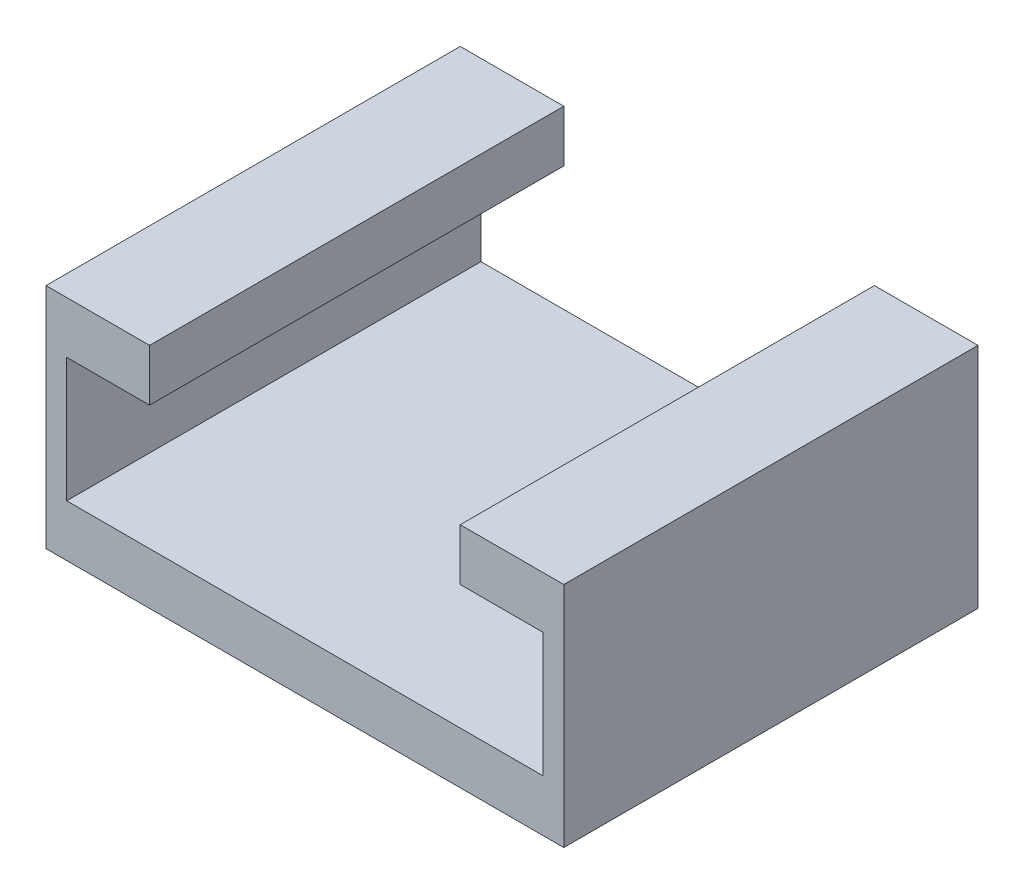
ISO-10303-21;
HEADER;
FILE_DESCRIPTION(('STEP AP214'),'2;1');
FILE_NAME('part.step','',(''),(''),'','','');
FILE_SCHEMA(('AUTOMOTIVE_DESIGN { 1 0 10303 214 1 1 1 1 }'));
ENDSEC;
DATA;
#1=APPLICATION_CONTEXT('core data for automotive mechanical design processes');
#2=APPLICATION_PROTOCOL_DEFINITION('international standard','automotive_design',2000,#1);
#3=PRODUCT_CONTEXT('',#1,'mechanical');
#4=PRODUCT('Part','Part','',(#3));
#5=PRODUCT_RELATED_PRODUCT_CATEGORY('part','',(#4));
#6=PRODUCT_DEFINITION_FORMATION('','',#4);
#7=PRODUCT_DEFINITION_CONTEXT('part definition',#1,'design');
#8=PRODUCT_DEFINITION('design','',#6,#7);
#9=PRODUCT_DEFINITION_SHAPE('','',#8);
#10=(LENGTH_UNIT() NAMED_UNIT(*) SI_UNIT(.MILLI.,.METRE.));
#11=(NAMED_UNIT(*) PLANE_ANGLE_UNIT() SI_UNIT($,.RADIAN.));
#12=(NAMED_UNIT(*) SI_UNIT($,.STERADIAN.) SOLID_ANGLE_UNIT());
#13=UNCERTAINTY_MEASURE_WITH_UNIT(LENGTH_MEASURE(1.E-05),#10,'distance_accuracy_value','');
#14=(GEOMETRIC_REPRESENTATION_CONTEXT(3) GLOBAL_UNCERTAINTY_ASSIGNED_CONTEXT((#13)) GLOBAL_UNIT_ASSIGNED_CONTEXT((#10,
#11,#12)) REPRESENTATION_CONTEXT('',''));
#15=CARTESIAN_POINT('',(0.,0.,0.));
#16=DIRECTION('',(0.,0.,1.));
#17=DIRECTION('',(1.,0.,0.));
#18=AXIS2_PLACEMENT_3D('',#15,#16,#17);
#19=CARTESIAN_POINT('',(0.,0.,0.));
#20=DIRECTION('',(0.,1.,0.));
#21=DIRECTION('',(0.,0.,1.));
#22=AXIS2_PLACEMENT_3D('',#19,#20,#21);
#23=PLANE('',#22);
#24=DIRECTION('',(1.,0.,0.));
#25=VECTOR('',#24,1.);
#26=CARTESIAN_POINT('',(0.,0.,0.));
#27=LINE('',#26,#25);
#28=CARTESIAN_POINT('',(0.,0.,0.));
#29=VERTEX_POINT('',#28);
#30=CARTESIAN_POINT('',(50.,0.,0.));
#31=VERTEX_POINT('',#30);
#32=EDGE_CURVE('E270',#29,#31,#27,.T.);
#33=ORIENTED_EDGE('',*,*,#32,.F.);
#34=DIRECTION('',(0.,0.,-1.));
#35=VECTOR('',#34,1.);
#36=CARTESIAN_POINT('',(0.,0.,0.));
#37=LINE('',#36,#35);
#38=CARTESIAN_POINT('',(0.,0.,-40.));
#39=VERTEX_POINT('',#38);
#40=EDGE_CURVE('E285',#29,#39,#37,.T.);
#41=ORIENTED_EDGE('',*,*,#40,.T.);
#42=DIRECTION('',(1.,0.,0.));
#43=VECTOR('',#42,1.);
#44=CARTESIAN_POINT('',(0.,0.,-40.));
#45=LINE('',#44,#43);
#46=CARTESIAN_POINT('',(50.,0.,-40.));
#47=VERTEX_POINT('',#46);
#48=EDGE_CURVE('E279',#39,#47,#45,.T.);
#49=ORIENTED_EDGE('',*,*,#48,.T.);
#50=DIRECTION('',(0.,0.,-1.));
#51=VECTOR('',#50,1.);
#52=CARTESIAN_POINT('',(50.,0.,0.));
#53=LINE('',#52,#51);
#54=EDGE_CURVE('E274',#31,#47,#53,.T.);
#55=ORIENTED_EDGE('',*,*,#54,.F.);
#56=EDGE_LOOP('',(#33,#41,#49,#55));
#57=FACE_BOUND('',#56,.T.);
#58=DIRECTION('',(0.,0.,-1.));
#59=VECTOR('',#58,1.);
#60=CARTESIAN_POINT('',(10.,0.,0.));
#61=LINE('',#60,#59);
#62=CARTESIAN_POINT('',(10.,0.,-23.5));
#63=VERTEX_POINT('',#62);
#64=CARTESIAN_POINT('',(10.,0.,-28.5));
#65=VERTEX_POINT('',#64);
#66=EDGE_CURVE('E162',#63,#65,#61,.T.);
#67=ORIENTED_EDGE('',*,*,#66,.F.);
#68=DIRECTION('',(1.,0.,0.));
#69=VECTOR('',#68,1.);
#70=CARTESIAN_POINT('',(10.,0.,-23.5));
#71=LINE('',#70,#69);
#72=CARTESIAN_POINT('',(40.,0.,-23.5));
#73=VERTEX_POINT('',#72);
#74=EDGE_CURVE('E189',#63,#73,#71,.T.);
#75=ORIENTED_EDGE('',*,*,#74,.T.);
#76=DIRECTION('',(0.,0.,-1.));
#77=VECTOR('',#76,1.);
#78=CARTESIAN_POINT('',(40.,0.,0.));
#79=LINE('',#78,#77);
#80=CARTESIAN_POINT('',(40.,0.,-28.5));
#81=VERTEX_POINT('',#80);
#82=EDGE_CURVE('E170',#73,#81,#79,.T.);
#83=ORIENTED_EDGE('',*,*,#82,.T.);
#84=DIRECTION('',(1.,0.,0.));
#85=VECTOR('',#84,1.);
#86=CARTESIAN_POINT('',(10.,0.,-28.5));
#87=LINE('',#86,#85);
#88=EDGE_CURVE('E192',#65,#81,#87,.T.);
#89=ORIENTED_EDGE('',*,*,#88,.F.);
#90=EDGE_LOOP('',(#67,#75,#83,#89));
#91=FACE_BOUND('',#90,.T.);
#92=ADVANCED_FACE('F35',(#57,#91),#23,.F.);
#93=CARTESIAN_POINT('',(0.,5.,0.));
#94=DIRECTION('',(0.,1.,0.));
#95=DIRECTION('',(0.,0.,1.));
#96=AXIS2_PLACEMENT_3D('',#93,#94,#95);
#97=PLANE('',#96);
#98=DIRECTION('',(1.,0.,0.));
#99=VECTOR('',#98,1.);
#100=CARTESIAN_POINT('',(0.,5.,0.));
#101=LINE('',#100,#99);
#102=CARTESIAN_POINT('',(2.,5.,0.));
#103=VERTEX_POINT('',#102);
#104=CARTESIAN_POINT('',(48.,5.,0.));
#105=VERTEX_POINT('',#104);
#106=EDGE_CURVE('E288',#103,#105,#101,.T.);
#107=ORIENTED_EDGE('',*,*,#106,.T.);
#108=DIRECTION('',(0.,0.,1.));
#109=VECTOR('',#108,1.);
#110=CARTESIAN_POINT('',(48.,5.,-40.));
#111=LINE('',#110,#109);
#112=CARTESIAN_POINT('',(48.,5.,-40.));
#113=VERTEX_POINT('',#112);
#114=EDGE_CURVE('E60',#113,#105,#111,.T.);
#115=ORIENTED_EDGE('',*,*,#114,.F.);
#116=DIRECTION('',(1.,0.,0.));
#117=VECTOR('',#116,1.);
#118=CARTESIAN_POINT('',(0.,5.,-40.));
#119=LINE('',#118,#117);
#120=CARTESIAN_POINT('',(2.,5.,-40.));
#121=VERTEX_POINT('',#120);
#122=EDGE_CURVE('E263',#121,#113,#119,.T.);
#123=ORIENTED_EDGE('',*,*,#122,.F.);
#124=DIRECTION('',(0.,0.,-1.));
#125=VECTOR('',#124,1.);
#126=CARTESIAN_POINT('',(2.,5.,-40.));
#127=LINE('',#126,#125);
#128=EDGE_CURVE('E250',#103,#121,#127,.T.);
#129=ORIENTED_EDGE('',*,*,#128,.F.);
#130=EDGE_LOOP('',(#107,#115,#123,#129));
#131=FACE_BOUND('',#130,.T.);
#132=ADVANCED_FACE('F338',(#131),#97,.T.);
#133=CARTESIAN_POINT('',(0.,5.,0.));
#134=DIRECTION('',(0.,0.,-1.));
#135=DIRECTION('',(-1.,0.,0.));
#136=AXIS2_PLACEMENT_3D('',#133,#134,#135);
#137=PLANE('',#136);
#138=ORIENTED_EDGE('',*,*,#32,.T.);
#139=DIRECTION('',(0.,-1.,0.));
#140=VECTOR('',#139,1.);
#141=CARTESIAN_POINT('',(50.,5.,0.));
#142=LINE('',#141,#140);
#143=CARTESIAN_POINT('',(50.,22.,0.));
#144=VERTEX_POINT('',#143);
#145=EDGE_CURVE('E11',#144,#31,#142,.T.);
#146=ORIENTED_EDGE('',*,*,#145,.F.);
#147=DIRECTION('',(1.,0.,0.));
#148=VECTOR('',#147,1.);
#149=CARTESIAN_POINT('',(50.,22.,0.));
#150=LINE('',#149,#148);
#151=CARTESIAN_POINT('',(40.,22.,0.));
#152=VERTEX_POINT('',#151);
#153=EDGE_CURVE('E203',#152,#144,#150,.T.);
#154=ORIENTED_EDGE('',*,*,#153,.F.);
#155=DIRECTION('',(0.,-1.,0.));
#156=VECTOR('',#155,1.);
#157=CARTESIAN_POINT('',(40.,22.,0.));
#158=LINE('',#157,#156);
#159=CARTESIAN_POINT('',(40.,17.,0.));
#160=VERTEX_POINT('',#159);
#161=EDGE_CURVE('E206',#152,#160,#158,.T.);
#162=ORIENTED_EDGE('',*,*,#161,.T.);
#163=DIRECTION('',(1.,0.,0.));
#164=VECTOR('',#163,1.);
#165=CARTESIAN_POINT('',(50.,17.,0.));
#166=LINE('',#165,#164);
#167=CARTESIAN_POINT('',(48.,17.,0.));
#168=VERTEX_POINT('',#167);
#169=EDGE_CURVE('E199',#160,#168,#166,.T.);
#170=ORIENTED_EDGE('',*,*,#169,.T.);
#171=DIRECTION('',(0.,-1.,0.));
#172=VECTOR('',#171,1.);
#173=CARTESIAN_POINT('',(48.,17.,0.));
#174=LINE('',#173,#172);
#175=EDGE_CURVE('E243',#168,#105,#174,.T.);
#176=ORIENTED_EDGE('',*,*,#175,.T.);
#177=ORIENTED_EDGE('',*,*,#106,.F.);
#178=DIRECTION('',(0.,-1.,0.));
#179=VECTOR('',#178,1.);
#180=CARTESIAN_POINT('',(2.,17.,0.));
#181=LINE('',#180,#179);
#182=CARTESIAN_POINT('',(2.,17.,0.));
#183=VERTEX_POINT('',#182);
#184=EDGE_CURVE('E267',#183,#103,#181,.T.);
#185=ORIENTED_EDGE('',*,*,#184,.F.);
#186=DIRECTION('',(1.,0.,0.));
#187=VECTOR('',#186,1.);
#188=CARTESIAN_POINT('',(0.,17.,0.));
#189=LINE('',#188,#187);
#190=CARTESIAN_POINT('',(10.,17.,0.));
#191=VERTEX_POINT('',#190);
#192=EDGE_CURVE('E217',#183,#191,#189,.T.);
#193=ORIENTED_EDGE('',*,*,#192,.T.);
#194=DIRECTION('',(0.,-1.,0.));
#195=VECTOR('',#194,1.);
#196=CARTESIAN_POINT('',(10.,22.,0.));
#197=LINE('',#196,#195);
#198=CARTESIAN_POINT('',(10.,22.,0.));
#199=VERTEX_POINT('',#198);
#200=EDGE_CURVE('E237',#199,#191,#197,.T.);
#201=ORIENTED_EDGE('',*,*,#200,.F.);
#202=DIRECTION('',(1.,0.,0.));
#203=VECTOR('',#202,1.);
#204=CARTESIAN_POINT('',(0.,22.,0.));
#205=LINE('',#204,#203);
#206=CARTESIAN_POINT('',(0.,22.,0.));
#207=VERTEX_POINT('',#206);
#208=EDGE_CURVE('E221',#207,#199,#205,.T.);
#209=ORIENTED_EDGE('',*,*,#208,.F.);
#210=DIRECTION('',(0.,-1.,0.));
#211=VECTOR('',#210,1.);
#212=CARTESIAN_POINT('',(0.,5.,0.));
#213=LINE('',#212,#211);
#214=EDGE_CURVE('E289',#207,#29,#213,.T.);
#215=ORIENTED_EDGE('',*,*,#214,.T.);
#216=EDGE_LOOP('',(#138,#146,#154,#162,#170,#176,#177,#185,#193,#201,#209,#215));
#217=FACE_BOUND('',#216,.T.);
#218=ADVANCED_FACE('F37',(#217),#137,.F.);
#219=CARTESIAN_POINT('',(50.,5.,0.));
#220=DIRECTION('',(-1.,0.,0.));
#221=DIRECTION('',(0.,0.,1.));
#222=AXIS2_PLACEMENT_3D('',#219,#220,#221);
#223=PLANE('',#222);
#224=ORIENTED_EDGE('',*,*,#54,.T.);
#225=DIRECTION('',(0.,-1.,0.));
#226=VECTOR('',#225,1.);
#227=CARTESIAN_POINT('',(50.,5.,-40.));
#228=LINE('',#227,#226);
#229=CARTESIAN_POINT('',(50.,22.,-40.));
#230=VERTEX_POINT('',#229);
#231=EDGE_CURVE('E44',#230,#47,#228,.T.);
#232=ORIENTED_EDGE('',*,*,#231,.F.);
#233=DIRECTION('',(0.,0.,-1.));
#234=VECTOR('',#233,1.);
#235=CARTESIAN_POINT('',(50.,22.,-40.));
#236=LINE('',#235,#234);
#237=EDGE_CURVE('E195',#144,#230,#236,.T.);
#238=ORIENTED_EDGE('',*,*,#237,.F.);
#239=ORIENTED_EDGE('',*,*,#145,.T.);
#240=EDGE_LOOP('',(#224,#232,#238,#239));
#241=FACE_BOUND('',#240,.T.);
#242=ADVANCED_FACE('F316',(#241),#223,.F.);
#243=CARTESIAN_POINT('',(0.,5.,-40.));
#244=DIRECTION('',(0.,0.,-1.));
#245=DIRECTION('',(-1.,0.,0.));
#246=AXIS2_PLACEMENT_3D('',#243,#244,#245);
#247=PLANE('',#246);
#248=ORIENTED_EDGE('',*,*,#48,.F.);
#249=DIRECTION('',(0.,-1.,0.));
#250=VECTOR('',#249,1.);
#251=CARTESIAN_POINT('',(0.,5.,-40.));
#252=LINE('',#251,#250);
#253=CARTESIAN_POINT('',(0.,22.,-40.));
#254=VERTEX_POINT('',#253);
#255=EDGE_CURVE('E291',#254,#39,#252,.T.);
#256=ORIENTED_EDGE('',*,*,#255,.F.);
#257=DIRECTION('',(-1.,0.,0.));
#258=VECTOR('',#257,1.);
#259=CARTESIAN_POINT('',(0.,22.,-40.));
#260=LINE('',#259,#258);
#261=CARTESIAN_POINT('',(10.,22.,-40.));
#262=VERTEX_POINT('',#261);
#263=EDGE_CURVE('E226',#262,#254,#260,.T.);
#264=ORIENTED_EDGE('',*,*,#263,.F.);
#265=DIRECTION('',(0.,-1.,0.));
#266=VECTOR('',#265,1.);
#267=CARTESIAN_POINT('',(10.,22.,-40.));
#268=LINE('',#267,#266);
#269=CARTESIAN_POINT('',(10.,17.,-40.));
#270=VERTEX_POINT('',#269);
#271=EDGE_CURVE('E229',#262,#270,#268,.T.);
#272=ORIENTED_EDGE('',*,*,#271,.T.);
#273=DIRECTION('',(-1.,0.,0.));
#274=VECTOR('',#273,1.);
#275=CARTESIAN_POINT('',(0.,17.,-40.));
#276=LINE('',#275,#274);
#277=CARTESIAN_POINT('',(2.,17.,-40.));
#278=VERTEX_POINT('',#277);
#279=EDGE_CURVE('E222',#270,#278,#276,.T.);
#280=ORIENTED_EDGE('',*,*,#279,.T.);
#281=DIRECTION('',(0.,-1.,0.));
#282=VECTOR('',#281,1.);
#283=CARTESIAN_POINT('',(2.,17.,-40.));
#284=LINE('',#283,#282);
#285=EDGE_CURVE('E254',#278,#121,#284,.T.);
#286=ORIENTED_EDGE('',*,*,#285,.T.);
#287=ORIENTED_EDGE('',*,*,#122,.T.);
#288=DIRECTION('',(0.,-1.,0.));
#289=VECTOR('',#288,1.);
#290=CARTESIAN_POINT('',(48.,17.,-40.));
#291=LINE('',#290,#289);
#292=CARTESIAN_POINT('',(48.,17.,-40.));
#293=VERTEX_POINT('',#292);
#294=EDGE_CURVE('E247',#293,#113,#291,.T.);
#295=ORIENTED_EDGE('',*,*,#294,.F.);
#296=DIRECTION('',(-1.,0.,0.));
#297=VECTOR('',#296,1.);
#298=CARTESIAN_POINT('',(50.,17.,-40.));
#299=LINE('',#298,#297);
#300=CARTESIAN_POINT('',(40.,17.,-40.));
#301=VERTEX_POINT('',#300);
#302=EDGE_CURVE('E191',#293,#301,#299,.T.);
#303=ORIENTED_EDGE('',*,*,#302,.T.);
#304=DIRECTION('',(0.,-1.,0.));
#305=VECTOR('',#304,1.);
#306=CARTESIAN_POINT('',(40.,22.,-40.));
#307=LINE('',#306,#305);
#308=CARTESIAN_POINT('',(40.,22.,-40.));
#309=VERTEX_POINT('',#308);
#310=EDGE_CURVE('E214',#309,#301,#307,.T.);
#311=ORIENTED_EDGE('',*,*,#310,.F.);
#312=DIRECTION('',(-1.,0.,0.));
#313=VECTOR('',#312,1.);
#314=CARTESIAN_POINT('',(50.,22.,-40.));
#315=LINE('',#314,#313);
#316=EDGE_CURVE('E198',#230,#309,#315,.T.);
#317=ORIENTED_EDGE('',*,*,#316,.F.);
#318=ORIENTED_EDGE('',*,*,#231,.T.);
#319=EDGE_LOOP('',(#248,#256,#264,#272,#280,#286,#287,#295,#303,#311,#317,#318));
#320=FACE_BOUND('',#319,.T.);
#321=ADVANCED_FACE('F296',(#320),#247,.T.);
#322=CARTESIAN_POINT('',(0.,5.,0.));
#323=DIRECTION('',(-1.,0.,0.));
#324=DIRECTION('',(0.,0.,1.));
#325=AXIS2_PLACEMENT_3D('',#322,#323,#324);
#326=PLANE('',#325);
#327=ORIENTED_EDGE('',*,*,#40,.F.);
#328=ORIENTED_EDGE('',*,*,#214,.F.);
#329=DIRECTION('',(0.,0.,1.));
#330=VECTOR('',#329,1.);
#331=CARTESIAN_POINT('',(0.,22.,-40.));
#332=LINE('',#331,#330);
#333=EDGE_CURVE('E218',#254,#207,#332,.T.);
#334=ORIENTED_EDGE('',*,*,#333,.F.);
#335=ORIENTED_EDGE('',*,*,#255,.T.);
#336=EDGE_LOOP('',(#327,#328,#334,#335));
#337=FACE_BOUND('',#336,.T.);
#338=ADVANCED_FACE('F321',(#337),#326,.T.);
#339=CARTESIAN_POINT('',(2.,17.,-40.));
#340=DIRECTION('',(-1.,0.,0.));
#341=DIRECTION('',(0.,0.,1.));
#342=AXIS2_PLACEMENT_3D('',#339,#340,#341);
#343=PLANE('',#342);
#344=ORIENTED_EDGE('',*,*,#128,.T.);
#345=ORIENTED_EDGE('',*,*,#285,.F.);
#346=DIRECTION('',(0.,0.,-1.));
#347=VECTOR('',#346,1.);
#348=CARTESIAN_POINT('',(2.,17.,-40.));
#349=LINE('',#348,#347);
#350=EDGE_CURVE('E251',#183,#278,#349,.T.);
#351=ORIENTED_EDGE('',*,*,#350,.F.);
#352=ORIENTED_EDGE('',*,*,#184,.T.);
#353=EDGE_LOOP('',(#344,#345,#351,#352));
#354=FACE_BOUND('',#353,.T.);
#355=ADVANCED_FACE('F337',(#354),#343,.F.);
#356=CARTESIAN_POINT('',(48.,17.,-40.));
#357=DIRECTION('',(1.,0.,0.));
#358=DIRECTION('',(0.,0.,-1.));
#359=AXIS2_PLACEMENT_3D('',#356,#357,#358);
#360=PLANE('',#359);
#361=ORIENTED_EDGE('',*,*,#114,.T.);
#362=ORIENTED_EDGE('',*,*,#175,.F.);
#363=DIRECTION('',(0.,0.,1.));
#364=VECTOR('',#363,1.);
#365=CARTESIAN_POINT('',(48.,17.,-40.));
#366=LINE('',#365,#364);
#367=EDGE_CURVE('E240',#293,#168,#366,.T.);
#368=ORIENTED_EDGE('',*,*,#367,.F.);
#369=ORIENTED_EDGE('',*,*,#294,.T.);
#370=EDGE_LOOP('',(#361,#362,#368,#369));
#371=FACE_BOUND('',#370,.T.);
#372=ADVANCED_FACE('F299',(#371),#360,.F.);
#373=CARTESIAN_POINT('',(0.,17.,0.));
#374=DIRECTION('',(0.,1.,0.));
#375=DIRECTION('',(0.,0.,1.));
#376=AXIS2_PLACEMENT_3D('',#373,#374,#375);
#377=PLANE('',#376);
#378=ORIENTED_EDGE('',*,*,#192,.F.);
#379=ORIENTED_EDGE('',*,*,#350,.T.);
#380=ORIENTED_EDGE('',*,*,#279,.F.);
#381=DIRECTION('',(0.,0.,-1.));
#382=VECTOR('',#381,1.);
#383=CARTESIAN_POINT('',(10.,17.,-40.));
#384=LINE('',#383,#382);
#385=EDGE_CURVE('E231',#191,#270,#384,.T.);
#386=ORIENTED_EDGE('',*,*,#385,.F.);
#387=EDGE_LOOP('',(#378,#379,#380,#386));
#388=FACE_BOUND('',#387,.T.);
#389=ADVANCED_FACE('F336',(#388),#377,.F.);
#390=CARTESIAN_POINT('',(10.,22.,-40.));
#391=DIRECTION('',(-1.,0.,0.));
#392=DIRECTION('',(0.,0.,1.));
#393=AXIS2_PLACEMENT_3D('',#390,#391,#392);
#394=PLANE('',#393);
#395=ORIENTED_EDGE('',*,*,#385,.T.);
#396=ORIENTED_EDGE('',*,*,#271,.F.);
#397=DIRECTION('',(0.,0.,-1.));
#398=VECTOR('',#397,1.);
#399=CARTESIAN_POINT('',(10.,22.,-40.));
#400=LINE('',#399,#398);
#401=EDGE_CURVE('E224',#199,#262,#400,.T.);
#402=ORIENTED_EDGE('',*,*,#401,.F.);
#403=ORIENTED_EDGE('',*,*,#200,.T.);
#404=EDGE_LOOP('',(#395,#396,#402,#403));
#405=FACE_BOUND('',#404,.T.);
#406=ADVANCED_FACE('F331',(#405),#394,.F.);
#407=CARTESIAN_POINT('',(0.,22.,0.));
#408=DIRECTION('',(0.,1.,0.));
#409=DIRECTION('',(0.,0.,1.));
#410=AXIS2_PLACEMENT_3D('',#407,#408,#409);
#411=PLANE('',#410);
#412=ORIENTED_EDGE('',*,*,#333,.T.);
#413=ORIENTED_EDGE('',*,*,#208,.T.);
#414=ORIENTED_EDGE('',*,*,#401,.T.);
#415=ORIENTED_EDGE('',*,*,#263,.T.);
#416=EDGE_LOOP('',(#412,#413,#414,#415));
#417=FACE_BOUND('',#416,.T.);
#418=ADVANCED_FACE('F326',(#417),#411,.T.);
#419=CARTESIAN_POINT('',(0.,17.,0.));
#420=DIRECTION('',(0.,-1.,0.));
#421=DIRECTION('',(0.,0.,-1.));
#422=AXIS2_PLACEMENT_3D('',#419,#420,#421);
#423=PLANE('',#422);
#424=ORIENTED_EDGE('',*,*,#367,.T.);
#425=ORIENTED_EDGE('',*,*,#169,.F.);
#426=DIRECTION('',(0.,0.,1.));
#427=VECTOR('',#426,1.);
#428=CARTESIAN_POINT('',(40.,17.,-40.));
#429=LINE('',#428,#427);
#430=EDGE_CURVE('E208',#301,#160,#429,.T.);
#431=ORIENTED_EDGE('',*,*,#430,.F.);
#432=ORIENTED_EDGE('',*,*,#302,.F.);
#433=EDGE_LOOP('',(#424,#425,#431,#432));
#434=FACE_BOUND('',#433,.T.);
#435=ADVANCED_FACE('F304',(#434),#423,.T.);
#436=CARTESIAN_POINT('',(40.,22.,-40.));
#437=DIRECTION('',(1.,0.,0.));
#438=DIRECTION('',(0.,0.,-1.));
#439=AXIS2_PLACEMENT_3D('',#436,#437,#438);
#440=PLANE('',#439);
#441=ORIENTED_EDGE('',*,*,#430,.T.);
#442=ORIENTED_EDGE('',*,*,#161,.F.);
#443=DIRECTION('',(0.,0.,1.));
#444=VECTOR('',#443,1.);
#445=CARTESIAN_POINT('',(40.,22.,-40.));
#446=LINE('',#445,#444);
#447=EDGE_CURVE('E201',#309,#152,#446,.T.);
#448=ORIENTED_EDGE('',*,*,#447,.F.);
#449=ORIENTED_EDGE('',*,*,#310,.T.);
#450=EDGE_LOOP('',(#441,#442,#448,#449));
#451=FACE_BOUND('',#450,.T.);
#452=ADVANCED_FACE('F309',(#451),#440,.F.);
#453=CARTESIAN_POINT('',(0.,22.,0.));
#454=DIRECTION('',(0.,-1.,0.));
#455=DIRECTION('',(0.,0.,-1.));
#456=AXIS2_PLACEMENT_3D('',#453,#454,#455);
#457=PLANE('',#456);
#458=ORIENTED_EDGE('',*,*,#237,.T.);
#459=ORIENTED_EDGE('',*,*,#316,.T.);
#460=ORIENTED_EDGE('',*,*,#447,.T.);
#461=ORIENTED_EDGE('',*,*,#153,.T.);
#462=EDGE_LOOP('',(#458,#459,#460,#461));
#463=FACE_BOUND('',#462,.T.);
#464=ADVANCED_FACE('F313',(#463),#457,.F.);
#465=CARTESIAN_POINT('',(10.,0.,-23.5));
#466=DIRECTION('',(0.,0.,1.));
#467=DIRECTION('',(1.,0.,0.));
#468=AXIS2_PLACEMENT_3D('',#465,#466,#467);
#469=PLANE('',#468);
#470=DIRECTION('',(1.,0.,0.));
#471=VECTOR('',#470,1.);
#472=CARTESIAN_POINT('',(10.,-2.5,-23.5));
#473=LINE('',#472,#471);
#474=CARTESIAN_POINT('',(10.,-2.5,-23.5));
#475=VERTEX_POINT('',#474);
#476=CARTESIAN_POINT('',(40.,-2.5,-23.5));
#477=VERTEX_POINT('',#476);
#478=EDGE_CURVE('E151',#475,#477,#473,.T.);
#479=ORIENTED_EDGE('',*,*,#478,.T.);
#480=DIRECTION('',(0.,-1.,0.));
#481=VECTOR('',#480,1.);
#482=CARTESIAN_POINT('',(40.,0.,-23.5));
#483=LINE('',#482,#481);
#484=EDGE_CURVE('E155',#73,#477,#483,.T.);
#485=ORIENTED_EDGE('',*,*,#484,.F.);
#486=ORIENTED_EDGE('',*,*,#74,.F.);
#487=DIRECTION('',(0.,-1.,0.));
#488=VECTOR('',#487,1.);
#489=CARTESIAN_POINT('',(10.,0.,-23.5));
#490=LINE('',#489,#488);
#491=EDGE_CURVE('E157',#63,#475,#490,.T.);
#492=ORIENTED_EDGE('',*,*,#491,.T.);
#493=EDGE_LOOP('',(#479,#485,#486,#492));
#494=FACE_BOUND('',#493,.T.);
#495=ADVANCED_FACE('F153',(#494),#469,.T.);
#496=CARTESIAN_POINT('',(10.,0.,-28.5));
#497=DIRECTION('',(0.,0.,1.));
#498=DIRECTION('',(1.,0.,0.));
#499=AXIS2_PLACEMENT_3D('',#496,#497,#498);
#500=PLANE('',#499);
#501=ORIENTED_EDGE('',*,*,#88,.T.);
#502=DIRECTION('',(0.,-1.,0.));
#503=VECTOR('',#502,1.);
#504=CARTESIAN_POINT('',(40.,0.,-28.5));
#505=LINE('',#504,#503);
#506=CARTESIAN_POINT('',(40.,-2.5,-28.5));
#507=VERTEX_POINT('',#506);
#508=EDGE_CURVE('E52',#81,#507,#505,.T.);
#509=ORIENTED_EDGE('',*,*,#508,.T.);
#510=DIRECTION('',(1.,0.,0.));
#511=VECTOR('',#510,1.);
#512=CARTESIAN_POINT('',(10.,-2.5,-28.5));
#513=LINE('',#512,#511);
#514=CARTESIAN_POINT('',(10.,-2.5,-28.5));
#515=VERTEX_POINT('',#514);
#516=EDGE_CURVE('E161',#515,#507,#513,.T.);
#517=ORIENTED_EDGE('',*,*,#516,.F.);
#518=DIRECTION('',(0.,-1.,0.));
#519=VECTOR('',#518,1.);
#520=CARTESIAN_POINT('',(10.,0.,-28.5));
#521=LINE('',#520,#519);
#522=EDGE_CURVE('E185',#65,#515,#521,.T.);
#523=ORIENTED_EDGE('',*,*,#522,.F.);
#524=EDGE_LOOP('',(#501,#509,#517,#523));
#525=FACE_BOUND('',#524,.T.);
#526=ADVANCED_FACE('F415',(#525),#500,.F.);
#527=CARTESIAN_POINT('',(10.,-2.,-26.));
#528=DIRECTION('',(1.,0.,0.));
#529=DIRECTION('',(0.,0.,-1.));
#530=AXIS2_PLACEMENT_3D('',#527,#528,#529);
#531=CYLINDRICAL_SURFACE('',#530,1.5);
#532=CARTESIAN_POINT('',(10.,-2.,-26.));
#533=DIRECTION('',(1.,0.,0.));
#534=DIRECTION('',(0.,0.,-1.));
#535=AXIS2_PLACEMENT_3D('',#532,#533,#534);
#536=CIRCLE('',#535,1.5);
#537=CARTESIAN_POINT('',(10.,-2.,-27.5));
#538=VERTEX_POINT('',#537);
#539=EDGE_CURVE('E179',#538,#538,#536,.T.);
#540=ORIENTED_EDGE('',*,*,#539,.F.);
#541=EDGE_LOOP('',(#540));
#542=FACE_BOUND('',#541,.T.);
#543=CARTESIAN_POINT('',(40.,-2.,-26.));
#544=DIRECTION('',(1.,0.,0.));
#545=DIRECTION('',(0.,0.,-1.));
#546=AXIS2_PLACEMENT_3D('',#543,#544,#545);
#547=CIRCLE('',#546,1.5);
#548=CARTESIAN_POINT('',(40.,-2.,-27.5));
#549=VERTEX_POINT('',#548);
#550=EDGE_CURVE('E172',#549,#549,#547,.T.);
#551=ORIENTED_EDGE('',*,*,#550,.T.);
#552=EDGE_LOOP('',(#551));
#553=FACE_BOUND('',#552,.T.);
#554=ADVANCED_FACE('F422',(#542,#553),#531,.F.);
#555=CARTESIAN_POINT('',(10.,-2.5,-26.));
#556=DIRECTION('',(1.,0.,0.));
#557=DIRECTION('',(0.,0.,-1.));
#558=AXIS2_PLACEMENT_3D('',#555,#556,#557);
#559=CYLINDRICAL_SURFACE('',#558,2.5);
#560=ORIENTED_EDGE('',*,*,#516,.T.);
#561=CARTESIAN_POINT('',(40.,-2.5,-26.));
#562=DIRECTION('',(1.,0.,0.));
#563=DIRECTION('',(0.,0.,-1.));
#564=AXIS2_PLACEMENT_3D('',#561,#562,#563);
#565=CIRCLE('',#564,2.5);
#566=EDGE_CURVE('E164',#477,#507,#565,.T.);
#567=ORIENTED_EDGE('',*,*,#566,.F.);
#568=ORIENTED_EDGE('',*,*,#478,.F.);
#569=CARTESIAN_POINT('',(10.,-2.5,-26.));
#570=DIRECTION('',(1.,0.,0.));
#571=DIRECTION('',(0.,0.,-1.));
#572=AXIS2_PLACEMENT_3D('',#569,#570,#571);
#573=CIRCLE('',#572,2.5);
#574=EDGE_CURVE('E183',#475,#515,#573,.T.);
#575=ORIENTED_EDGE('',*,*,#574,.T.);
#576=EDGE_LOOP('',(#560,#567,#568,#575));
#577=FACE_BOUND('',#576,.T.);
#578=ADVANCED_FACE('F165',(#577),#559,.T.);
#579=CARTESIAN_POINT('',(10.,0.,0.));
#580=DIRECTION('',(1.,0.,0.));
#581=DIRECTION('',(0.,0.,-1.));
#582=AXIS2_PLACEMENT_3D('',#579,#580,#581);
#583=PLANE('',#582);
#584=ORIENTED_EDGE('',*,*,#539,.T.);
#585=EDGE_LOOP('',(#584));
#586=FACE_BOUND('',#585,.T.);
#587=ORIENTED_EDGE('',*,*,#491,.F.);
#588=ORIENTED_EDGE('',*,*,#66,.T.);
#589=ORIENTED_EDGE('',*,*,#522,.T.);
#590=ORIENTED_EDGE('',*,*,#574,.F.);
#591=EDGE_LOOP('',(#587,#588,#589,#590));
#592=FACE_BOUND('',#591,.T.);
#593=ADVANCED_FACE('F437',(#586,#592),#583,.F.);
#594=CARTESIAN_POINT('',(40.,0.,0.));
#595=DIRECTION('',(1.,0.,0.));
#596=DIRECTION('',(0.,0.,-1.));
#597=AXIS2_PLACEMENT_3D('',#594,#595,#596);
#598=PLANE('',#597);
#599=ORIENTED_EDGE('',*,*,#550,.F.);
#600=EDGE_LOOP('',(#599));
#601=FACE_BOUND('',#600,.T.);
#602=ORIENTED_EDGE('',*,*,#484,.T.);
#603=ORIENTED_EDGE('',*,*,#566,.T.);
#604=ORIENTED_EDGE('',*,*,#508,.F.);
#605=ORIENTED_EDGE('',*,*,#82,.F.);
#606=EDGE_LOOP('',(#602,#603,#604,#605));
#607=FACE_BOUND('',#606,.T.);
#608=ADVANCED_FACE('F168',(#601,#607),#598,.T.);
#609=CLOSED_SHELL('',(#92,#132,#218,#242,#321,#338,#355,#372,#389,#406,#418,#435,#452,#464,#495,
#526,#554,#578,#593,#608));
#610=MANIFOLD_SOLID_BREP('B2',#609);
#611=ADVANCED_BREP_SHAPE_REPRESENTATION('',(#18,#610),#14);
#612=SHAPE_DEFINITION_REPRESENTATION(#9,#611);
ENDSEC;
END-ISO-10303-21;
